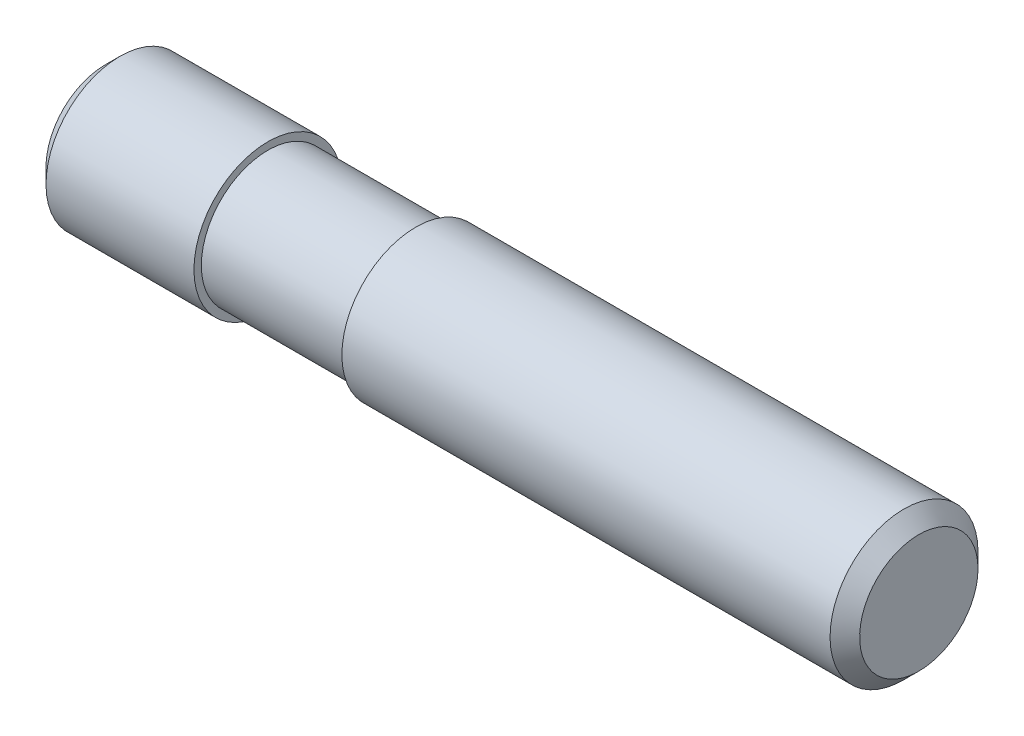
ISO-10303-21;
HEADER;
FILE_DESCRIPTION(('STEP AP214'),'2;1');
FILE_NAME('part.step','',(''),(''),'','','');
FILE_SCHEMA(('AUTOMOTIVE_DESIGN { 1 0 10303 214 1 1 1 1 }'));
ENDSEC;
DATA;
#1=APPLICATION_CONTEXT('core data for automotive mechanical design processes');
#2=APPLICATION_PROTOCOL_DEFINITION('international standard','automotive_design',2000,#1);
#3=PRODUCT_CONTEXT('',#1,'mechanical');
#4=PRODUCT('Part','Part','',(#3));
#5=PRODUCT_RELATED_PRODUCT_CATEGORY('part','',(#4));
#6=PRODUCT_DEFINITION_FORMATION('','',#4);
#7=PRODUCT_DEFINITION_CONTEXT('part definition',#1,'design');
#8=PRODUCT_DEFINITION('design','',#6,#7);
#9=PRODUCT_DEFINITION_SHAPE('','',#8);
#10=(LENGTH_UNIT() NAMED_UNIT(*) SI_UNIT(.MILLI.,.METRE.));
#11=(NAMED_UNIT(*) PLANE_ANGLE_UNIT() SI_UNIT($,.RADIAN.));
#12=(NAMED_UNIT(*) SI_UNIT($,.STERADIAN.) SOLID_ANGLE_UNIT());
#13=UNCERTAINTY_MEASURE_WITH_UNIT(LENGTH_MEASURE(1.E-05),#10,'distance_accuracy_value','');
#14=(GEOMETRIC_REPRESENTATION_CONTEXT(3) GLOBAL_UNCERTAINTY_ASSIGNED_CONTEXT((#13)) GLOBAL_UNIT_ASSIGNED_CONTEXT((#10,
#11,#12)) REPRESENTATION_CONTEXT('',''));
#15=CARTESIAN_POINT('',(0.,0.,0.));
#16=DIRECTION('',(0.,0.,1.));
#17=DIRECTION('',(1.,0.,0.));
#18=AXIS2_PLACEMENT_3D('',#15,#16,#17);
#19=CARTESIAN_POINT('',(-6.3,-10.,81.949300195452));
#20=DIRECTION('',(1.,0.,0.));
#21=DIRECTION('',(0.,0.24841483327091,-0.968653741339487));
#22=AXIS2_PLACEMENT_3D('',#19,#20,#21);
#23=CONICAL_SURFACE('',#22,1.,0.785398163397448);
#24=CARTESIAN_POINT('',(-6.5,-10.,81.949300195452));
#25=DIRECTION('',(-1.,0.,0.));
#26=DIRECTION('',(0.,0.24841483327091,-0.968653741339487));
#27=AXIS2_PLACEMENT_3D('',#24,#25,#26);
#28=CIRCLE('',#27,0.8);
#29=CARTESIAN_POINT('',(-6.5,-9.80126813338327,81.1743772023804));
#30=VERTEX_POINT('',#29);
#31=EDGE_CURVE('E47',#30,#30,#28,.T.);
#32=ORIENTED_EDGE('',*,*,#31,.F.);
#33=EDGE_LOOP('',(#32));
#34=FACE_BOUND('',#33,.T.);
#35=CARTESIAN_POINT('',(-6.3,-10.,81.949300195452));
#36=DIRECTION('',(1.,0.,0.));
#37=DIRECTION('',(0.,0.24841483327091,-0.968653741339487));
#38=AXIS2_PLACEMENT_3D('',#35,#36,#37);
#39=CIRCLE('',#38,1.);
#40=CARTESIAN_POINT('',(-6.3,-9.75158516672909,80.9806464541125));
#41=VERTEX_POINT('',#40);
#42=EDGE_CURVE('E11',#41,#41,#39,.T.);
#43=ORIENTED_EDGE('',*,*,#42,.F.);
#44=EDGE_LOOP('',(#43));
#45=FACE_BOUND('',#44,.T.);
#46=ADVANCED_FACE('F36',(#34,#45),#23,.T.);
#47=CARTESIAN_POINT('',(4.5,-10.,81.949300195452));
#48=DIRECTION('',(-1.,0.,0.));
#49=DIRECTION('',(0.,-0.24841483327091,0.968653741339487));
#50=AXIS2_PLACEMENT_3D('',#47,#48,#49);
#51=CONICAL_SURFACE('',#50,0.8,0.78539816339745);
#52=CARTESIAN_POINT('',(4.5,-10.,81.949300195452));
#53=DIRECTION('',(1.,0.,0.));
#54=DIRECTION('',(0.,0.24841483327091,-0.968653741339487));
#55=AXIS2_PLACEMENT_3D('',#52,#53,#54);
#56=CIRCLE('',#55,0.8);
#57=CARTESIAN_POINT('',(4.5,-9.80126813338327,81.1743772023804));
#58=VERTEX_POINT('',#57);
#59=EDGE_CURVE('E89',#58,#58,#56,.T.);
#60=ORIENTED_EDGE('',*,*,#59,.F.);
#61=EDGE_LOOP('',(#60));
#62=FACE_BOUND('',#61,.T.);
#63=CARTESIAN_POINT('',(4.3,-10.,81.949300195452));
#64=DIRECTION('',(-1.,0.,0.));
#65=DIRECTION('',(0.,0.24841483327091,-0.968653741339487));
#66=AXIS2_PLACEMENT_3D('',#63,#64,#65);
#67=CIRCLE('',#66,1.);
#68=CARTESIAN_POINT('',(4.3,-9.75158516672909,80.9806464541125));
#69=VERTEX_POINT('',#68);
#70=EDGE_CURVE('E93',#69,#69,#67,.T.);
#71=ORIENTED_EDGE('',*,*,#70,.F.);
#72=EDGE_LOOP('',(#71));
#73=FACE_BOUND('',#72,.T.);
#74=ADVANCED_FACE('F116',(#62,#73),#51,.T.);
#75=CARTESIAN_POINT('',(8.69999999999999,-10.,81.949300195452));
#76=DIRECTION('',(-1.,0.,0.));
#77=DIRECTION('',(0.,-0.24841483327091,0.968653741339487));
#78=AXIS2_PLACEMENT_3D('',#75,#76,#77);
#79=CYLINDRICAL_SURFACE('',#78,1.);
#80=ORIENTED_EDGE('',*,*,#42,.T.);
#81=EDGE_LOOP('',(#80));
#82=FACE_BOUND('',#81,.T.);
#83=CARTESIAN_POINT('',(-4.3,-10.,81.949300195452));
#84=DIRECTION('',(-1.,0.,0.));
#85=DIRECTION('',(0.,-0.24841483327091,0.968653741339487));
#86=AXIS2_PLACEMENT_3D('',#83,#84,#85);
#87=CIRCLE('',#86,1.);
#88=CARTESIAN_POINT('',(-4.3,-10.2484148332709,82.9179539367915));
#89=VERTEX_POINT('',#88);
#90=EDGE_CURVE('E84',#89,#89,#87,.T.);
#91=ORIENTED_EDGE('',*,*,#90,.T.);
#92=EDGE_LOOP('',(#91));
#93=FACE_BOUND('',#92,.T.);
#94=ADVANCED_FACE('F125',(#82,#93),#79,.T.);
#95=CARTESIAN_POINT('',(-6.5,-10.,81.949300195452));
#96=DIRECTION('',(1.,0.,0.));
#97=DIRECTION('',(0.,0.24841483327091,-0.968653741339487));
#98=AXIS2_PLACEMENT_3D('',#95,#96,#97);
#99=PLANE('',#98);
#100=ORIENTED_EDGE('',*,*,#31,.T.);
#101=EDGE_LOOP('',(#100));
#102=FACE_BOUND('',#101,.T.);
#103=ADVANCED_FACE('F135',(#102),#99,.F.);
#104=CARTESIAN_POINT('',(-2.3,-10.,81.949300195452));
#105=DIRECTION('',(-1.,0.,0.));
#106=DIRECTION('',(0.,-0.24841483327091,0.968653741339487));
#107=AXIS2_PLACEMENT_3D('',#104,#105,#106);
#108=CYLINDRICAL_SURFACE('',#107,0.9);
#109=CARTESIAN_POINT('',(-2.3,-10.,81.949300195452));
#110=DIRECTION('',(-1.,0.,0.));
#111=DIRECTION('',(0.,-0.24841483327091,0.968653741339487));
#112=AXIS2_PLACEMENT_3D('',#109,#110,#111);
#113=CIRCLE('',#112,0.9);
#114=CARTESIAN_POINT('',(-2.3,-10.2235733499438,82.8210885626576));
#115=VERTEX_POINT('',#114);
#116=EDGE_CURVE('E92',#115,#115,#113,.T.);
#117=ORIENTED_EDGE('',*,*,#116,.T.);
#118=EDGE_LOOP('',(#117));
#119=FACE_BOUND('',#118,.T.);
#120=CARTESIAN_POINT('',(-4.3,-10.,81.949300195452));
#121=DIRECTION('',(-1.,0.,0.));
#122=DIRECTION('',(0.,-0.24841483327091,0.968653741339487));
#123=AXIS2_PLACEMENT_3D('',#120,#121,#122);
#124=CIRCLE('',#123,0.9);
#125=CARTESIAN_POINT('',(-4.3,-10.2235733499438,82.8210885626576));
#126=VERTEX_POINT('',#125);
#127=EDGE_CURVE('E40',#126,#126,#124,.T.);
#128=ORIENTED_EDGE('',*,*,#127,.F.);
#129=EDGE_LOOP('',(#128));
#130=FACE_BOUND('',#129,.T.);
#131=ADVANCED_FACE('F130',(#119,#130),#108,.T.);
#132=CARTESIAN_POINT('',(-4.3,-10.,81.949300195452));
#133=DIRECTION('',(-1.,0.,0.));
#134=DIRECTION('',(0.,-0.968653741339487,-0.24841483327091));
#135=AXIS2_PLACEMENT_3D('',#132,#133,#134);
#136=PLANE('',#135);
#137=ORIENTED_EDGE('',*,*,#127,.T.);
#138=EDGE_LOOP('',(#137));
#139=FACE_BOUND('',#138,.T.);
#140=ORIENTED_EDGE('',*,*,#90,.F.);
#141=EDGE_LOOP('',(#140));
#142=FACE_BOUND('',#141,.T.);
#143=ADVANCED_FACE('F134',(#139,#142),#136,.F.);
#144=CARTESIAN_POINT('',(-2.3,-10.,81.949300195452));
#145=DIRECTION('',(-1.,0.,0.));
#146=DIRECTION('',(0.,-0.968653741339487,-0.24841483327091));
#147=AXIS2_PLACEMENT_3D('',#144,#145,#146);
#148=PLANE('',#147);
#149=ORIENTED_EDGE('',*,*,#116,.F.);
#150=EDGE_LOOP('',(#149));
#151=FACE_BOUND('',#150,.T.);
#152=CARTESIAN_POINT('',(-2.3,-10.,81.949300195452));
#153=DIRECTION('',(-1.,0.,0.));
#154=DIRECTION('',(0.,-0.24841483327091,0.968653741339487));
#155=AXIS2_PLACEMENT_3D('',#152,#153,#154);
#156=CIRCLE('',#155,1.);
#157=CARTESIAN_POINT('',(-2.3,-10.2484148332709,82.9179539367915));
#158=VERTEX_POINT('',#157);
#159=EDGE_CURVE('E100',#158,#158,#156,.T.);
#160=ORIENTED_EDGE('',*,*,#159,.T.);
#161=EDGE_LOOP('',(#160));
#162=FACE_BOUND('',#161,.T.);
#163=ADVANCED_FACE('F167',(#151,#162),#148,.T.);
#164=CARTESIAN_POINT('',(4.5,-10.,81.949300195452));
#165=DIRECTION('',(1.,0.,0.));
#166=DIRECTION('',(0.,0.24841483327091,-0.968653741339487));
#167=AXIS2_PLACEMENT_3D('',#164,#165,#166);
#168=PLANE('',#167);
#169=ORIENTED_EDGE('',*,*,#59,.T.);
#170=EDGE_LOOP('',(#169));
#171=FACE_BOUND('',#170,.T.);
#172=ADVANCED_FACE('F38',(#171),#168,.T.);
#173=CARTESIAN_POINT('',(8.69999999999999,-10.,81.949300195452));
#174=DIRECTION('',(-1.,0.,0.));
#175=DIRECTION('',(0.,-0.24841483327091,0.968653741339487));
#176=AXIS2_PLACEMENT_3D('',#173,#174,#175);
#177=CYLINDRICAL_SURFACE('',#176,1.);
#178=ORIENTED_EDGE('',*,*,#70,.T.);
#179=EDGE_LOOP('',(#178));
#180=FACE_BOUND('',#179,.T.);
#181=ORIENTED_EDGE('',*,*,#159,.F.);
#182=EDGE_LOOP('',(#181));
#183=FACE_BOUND('',#182,.T.);
#184=ADVANCED_FACE('F155',(#180,#183),#177,.T.);
#185=CLOSED_SHELL('',(#46,#74,#94,#103,#131,#143,#163,#172,#184));
#186=MANIFOLD_SOLID_BREP('B2',#185);
#187=ADVANCED_BREP_SHAPE_REPRESENTATION('',(#18,#186),#14);
#188=SHAPE_DEFINITION_REPRESENTATION(#9,#187);
ENDSEC;
END-ISO-10303-21;
